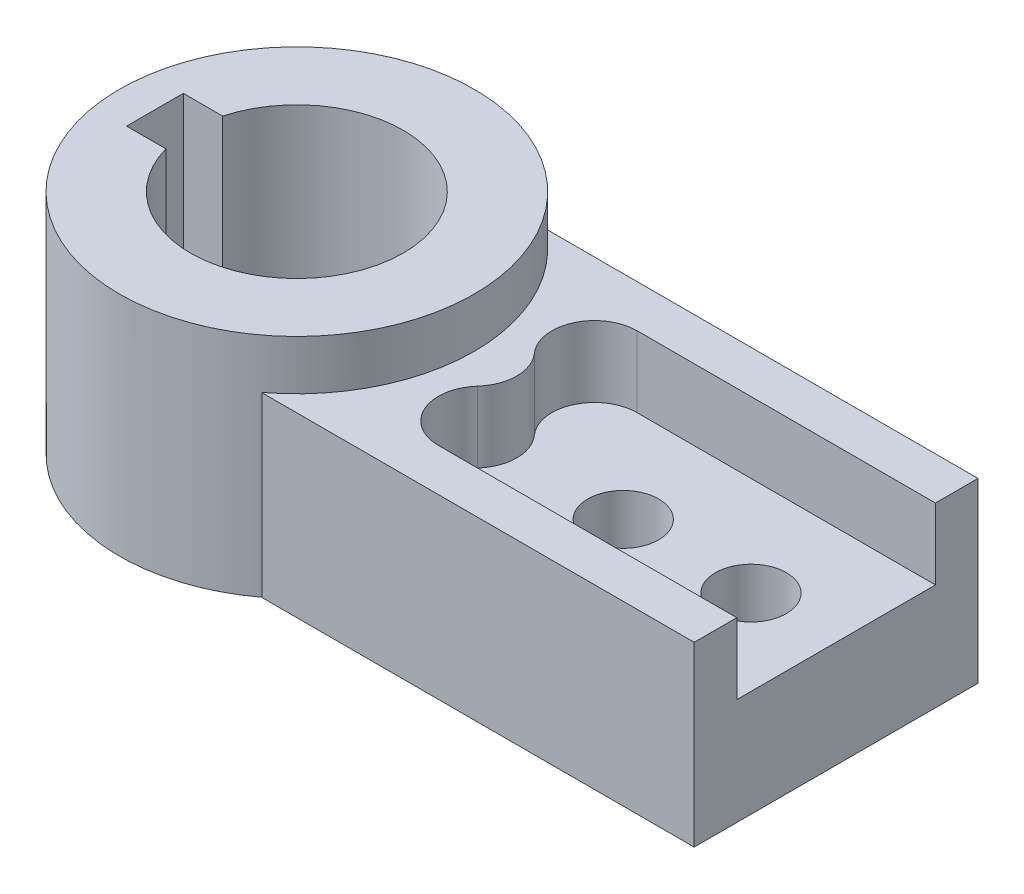
ISO-10303-21;
HEADER;
FILE_DESCRIPTION(('STEP AP214'),'2;1');
FILE_NAME('part.step','',(''),(''),'','','');
FILE_SCHEMA(('AUTOMOTIVE_DESIGN { 1 0 10303 214 1 1 1 1 }'));
ENDSEC;
DATA;
#1=APPLICATION_CONTEXT('core data for automotive mechanical design processes');
#2=APPLICATION_PROTOCOL_DEFINITION('international standard','automotive_design',2000,#1);
#3=PRODUCT_CONTEXT('',#1,'mechanical');
#4=PRODUCT('Part','Part','',(#3));
#5=PRODUCT_RELATED_PRODUCT_CATEGORY('part','',(#4));
#6=PRODUCT_DEFINITION_FORMATION('','',#4);
#7=PRODUCT_DEFINITION_CONTEXT('part definition',#1,'design');
#8=PRODUCT_DEFINITION('design','',#6,#7);
#9=PRODUCT_DEFINITION_SHAPE('','',#8);
#10=(LENGTH_UNIT() NAMED_UNIT(*) SI_UNIT(.MILLI.,.METRE.));
#11=(NAMED_UNIT(*) PLANE_ANGLE_UNIT() SI_UNIT($,.RADIAN.));
#12=(NAMED_UNIT(*) SI_UNIT($,.STERADIAN.) SOLID_ANGLE_UNIT());
#13=UNCERTAINTY_MEASURE_WITH_UNIT(LENGTH_MEASURE(1.E-05),#10,'distance_accuracy_value','');
#14=(GEOMETRIC_REPRESENTATION_CONTEXT(3) GLOBAL_UNCERTAINTY_ASSIGNED_CONTEXT((#13)) GLOBAL_UNIT_ASSIGNED_CONTEXT((#10,
#11,#12)) REPRESENTATION_CONTEXT('',''));
#15=CARTESIAN_POINT('',(0.,0.,0.));
#16=DIRECTION('',(0.,0.,1.));
#17=DIRECTION('',(1.,0.,0.));
#18=AXIS2_PLACEMENT_3D('',#15,#16,#17);
#19=CARTESIAN_POINT('',(0.,32.,0.));
#20=DIRECTION('',(0.,-1.,0.));
#21=DIRECTION('',(0.,0.,-1.));
#22=AXIS2_PLACEMENT_3D('',#19,#20,#21);
#23=CYLINDRICAL_SURFACE('',#22,25.);
#24=CARTESIAN_POINT('',(0.,32.,0.));
#25=DIRECTION('',(0.,1.,0.));
#26=DIRECTION('',(0.,0.,1.));
#27=AXIS2_PLACEMENT_3D('',#24,#25,#26);
#28=CIRCLE('',#27,25.);
#29=CARTESIAN_POINT('',(0.,32.,25.));
#30=VERTEX_POINT('',#29);
#31=EDGE_CURVE('E271',#30,#30,#28,.T.);
#32=ORIENTED_EDGE('',*,*,#31,.F.);
#33=EDGE_LOOP('',(#32));
#34=FACE_BOUND('',#33,.T.);
#35=DIRECTION('',(0.,-1.,0.));
#36=VECTOR('',#35,1.);
#37=CARTESIAN_POINT('',(15.0745700855955,32.,19.9438546107434));
#38=LINE('',#37,#36);
#39=CARTESIAN_POINT('',(15.0745700855955,25.,19.9438546107434));
#40=VERTEX_POINT('',#39);
#41=CARTESIAN_POINT('',(15.0745700855955,0.,19.9438546107434));
#42=VERTEX_POINT('',#41);
#43=EDGE_CURVE('E280',#40,#42,#38,.T.);
#44=ORIENTED_EDGE('',*,*,#43,.F.);
#45=CARTESIAN_POINT('',(0.,25.,0.));
#46=DIRECTION('',(0.,1.,0.));
#47=DIRECTION('',(0.,0.,1.));
#48=AXIS2_PLACEMENT_3D('',#45,#46,#47);
#49=CIRCLE('',#48,25.);
#50=CARTESIAN_POINT('',(15.0745700855955,25.,-19.9438546107434));
#51=VERTEX_POINT('',#50);
#52=EDGE_CURVE('E274',#40,#51,#49,.T.);
#53=ORIENTED_EDGE('',*,*,#52,.T.);
#54=DIRECTION('',(0.,-1.,0.));
#55=VECTOR('',#54,1.);
#56=CARTESIAN_POINT('',(15.0745700855955,32.,-19.9438546107434));
#57=LINE('',#56,#55);
#58=CARTESIAN_POINT('',(15.0745700855955,0.,-19.9438546107434));
#59=VERTEX_POINT('',#58);
#60=EDGE_CURVE('E277',#59,#51,#57,.F.);
#61=ORIENTED_EDGE('',*,*,#60,.F.);
#62=CARTESIAN_POINT('',(0.,0.,0.));
#63=DIRECTION('',(0.,1.,0.));
#64=DIRECTION('',(0.,0.,1.));
#65=AXIS2_PLACEMENT_3D('',#62,#63,#64);
#66=CIRCLE('',#65,25.);
#67=EDGE_CURVE('E268',#59,#42,#66,.T.);
#68=ORIENTED_EDGE('',*,*,#67,.T.);
#69=EDGE_LOOP('',(#44,#53,#61,#68));
#70=FACE_BOUND('',#69,.T.);
#71=ADVANCED_FACE('F35',(#34,#70),#23,.T.);
#72=CARTESIAN_POINT('',(0.,32.,0.));
#73=DIRECTION('',(0.,1.,0.));
#74=DIRECTION('',(0.,0.,1.));
#75=AXIS2_PLACEMENT_3D('',#72,#73,#74);
#76=PLANE('',#75);
#77=DIRECTION('',(-1.,0.,0.));
#78=VECTOR('',#77,1.);
#79=CARTESIAN_POINT('',(-20.,32.,-4.));
#80=LINE('',#79,#78);
#81=CARTESIAN_POINT('',(-14.456832294801,32.,-4.));
#82=VERTEX_POINT('',#81);
#83=CARTESIAN_POINT('',(-20.,32.,-4.));
#84=VERTEX_POINT('',#83);
#85=EDGE_CURVE('E153',#82,#84,#80,.T.);
#86=ORIENTED_EDGE('',*,*,#85,.F.);
#87=CARTESIAN_POINT('',(0.,32.,0.));
#88=DIRECTION('',(0.,1.,0.));
#89=DIRECTION('',(0.,0.,1.));
#90=AXIS2_PLACEMENT_3D('',#87,#88,#89);
#91=CIRCLE('',#90,15.);
#92=CARTESIAN_POINT('',(-14.456832294801,32.,4.));
#93=VERTEX_POINT('',#92);
#94=EDGE_CURVE('E167',#93,#82,#91,.T.);
#95=ORIENTED_EDGE('',*,*,#94,.F.);
#96=DIRECTION('',(1.,0.,0.));
#97=VECTOR('',#96,1.);
#98=CARTESIAN_POINT('',(-20.,32.,4.));
#99=LINE('',#98,#97);
#100=CARTESIAN_POINT('',(-20.,32.,4.));
#101=VERTEX_POINT('',#100);
#102=EDGE_CURVE('E49',#101,#93,#99,.T.);
#103=ORIENTED_EDGE('',*,*,#102,.F.);
#104=DIRECTION('',(0.,0.,1.));
#105=VECTOR('',#104,1.);
#106=CARTESIAN_POINT('',(-20.,32.,-4.));
#107=LINE('',#106,#105);
#108=EDGE_CURVE('E156',#84,#101,#107,.T.);
#109=ORIENTED_EDGE('',*,*,#108,.F.);
#110=EDGE_LOOP('',(#86,#95,#103,#109));
#111=FACE_BOUND('',#110,.T.);
#112=ORIENTED_EDGE('',*,*,#31,.T.);
#113=EDGE_LOOP('',(#112));
#114=FACE_BOUND('',#113,.T.);
#115=ADVANCED_FACE('F164',(#111,#114),#76,.T.);
#116=CARTESIAN_POINT('',(0.,0.,0.));
#117=DIRECTION('',(0.,1.,0.));
#118=DIRECTION('',(0.,0.,1.));
#119=AXIS2_PLACEMENT_3D('',#116,#117,#118);
#120=PLANE('',#119);
#121=CARTESIAN_POINT('',(46.,0.,0.));
#122=DIRECTION('',(0.,1.,0.));
#123=DIRECTION('',(0.,0.,1.));
#124=AXIS2_PLACEMENT_3D('',#121,#122,#123);
#125=CIRCLE('',#124,5.);
#126=CARTESIAN_POINT('',(46.,0.,5.));
#127=VERTEX_POINT('',#126);
#128=EDGE_CURVE('E185',#127,#127,#125,.T.);
#129=ORIENTED_EDGE('',*,*,#128,.T.);
#130=EDGE_LOOP('',(#129));
#131=FACE_BOUND('',#130,.T.);
#132=CARTESIAN_POINT('',(64.,0.,0.));
#133=DIRECTION('',(0.,1.,0.));
#134=DIRECTION('',(0.,0.,1.));
#135=AXIS2_PLACEMENT_3D('',#132,#133,#134);
#136=CIRCLE('',#135,5.);
#137=CARTESIAN_POINT('',(64.,0.,5.));
#138=VERTEX_POINT('',#137);
#139=EDGE_CURVE('E180',#138,#138,#136,.T.);
#140=ORIENTED_EDGE('',*,*,#139,.T.);
#141=EDGE_LOOP('',(#140));
#142=FACE_BOUND('',#141,.T.);
#143=DIRECTION('',(0.,0.,1.));
#144=VECTOR('',#143,1.);
#145=CARTESIAN_POINT('',(15.0745700855955,0.,-20.));
#146=LINE('',#145,#144);
#147=CARTESIAN_POINT('',(15.0745700855955,0.,20.));
#148=VERTEX_POINT('',#147);
#149=EDGE_CURVE('E249',#42,#148,#146,.T.);
#150=ORIENTED_EDGE('',*,*,#149,.F.);
#151=ORIENTED_EDGE('',*,*,#67,.F.);
#152=CARTESIAN_POINT('',(15.0745700855955,0.,-20.));
#153=VERTEX_POINT('',#152);
#154=EDGE_CURVE('E250',#153,#59,#146,.T.);
#155=ORIENTED_EDGE('',*,*,#154,.F.);
#156=DIRECTION('',(-1.,0.,0.));
#157=VECTOR('',#156,1.);
#158=CARTESIAN_POINT('',(15.0745700855955,0.,-20.));
#159=LINE('',#158,#157);
#160=CARTESIAN_POINT('',(76.,0.,-20.));
#161=VERTEX_POINT('',#160);
#162=EDGE_CURVE('E247',#161,#153,#159,.T.);
#163=ORIENTED_EDGE('',*,*,#162,.F.);
#164=DIRECTION('',(0.,0.,-1.));
#165=VECTOR('',#164,1.);
#166=CARTESIAN_POINT('',(76.,0.,-20.));
#167=LINE('',#166,#165);
#168=CARTESIAN_POINT('',(76.,0.,20.));
#169=VERTEX_POINT('',#168);
#170=EDGE_CURVE('E222',#169,#161,#167,.T.);
#171=ORIENTED_EDGE('',*,*,#170,.F.);
#172=DIRECTION('',(1.,0.,0.));
#173=VECTOR('',#172,1.);
#174=CARTESIAN_POINT('',(15.0745700855955,0.,20.));
#175=LINE('',#174,#173);
#176=EDGE_CURVE('E253',#148,#169,#175,.T.);
#177=ORIENTED_EDGE('',*,*,#176,.F.);
#178=EDGE_LOOP('',(#150,#151,#155,#163,#171,#177));
#179=FACE_BOUND('',#178,.T.);
#180=CARTESIAN_POINT('',(0.,0.,0.));
#181=DIRECTION('',(0.,1.,0.));
#182=DIRECTION('',(0.,0.,1.));
#183=AXIS2_PLACEMENT_3D('',#180,#181,#182);
#184=CIRCLE('',#183,15.);
#185=CARTESIAN_POINT('',(-14.456832294801,0.,4.));
#186=VERTEX_POINT('',#185);
#187=CARTESIAN_POINT('',(-14.456832294801,0.,-4.));
#188=VERTEX_POINT('',#187);
#189=EDGE_CURVE('E266',#186,#188,#184,.T.);
#190=ORIENTED_EDGE('',*,*,#189,.T.);
#191=DIRECTION('',(-1.,0.,0.));
#192=VECTOR('',#191,1.);
#193=CARTESIAN_POINT('',(0.,0.,-4.));
#194=LINE('',#193,#192);
#195=CARTESIAN_POINT('',(-20.,0.,-4.));
#196=VERTEX_POINT('',#195);
#197=EDGE_CURVE('E173',#188,#196,#194,.T.);
#198=ORIENTED_EDGE('',*,*,#197,.T.);
#199=DIRECTION('',(0.,0.,1.));
#200=VECTOR('',#199,1.);
#201=CARTESIAN_POINT('',(-20.,0.,0.));
#202=LINE('',#201,#200);
#203=CARTESIAN_POINT('',(-20.,0.,4.));
#204=VERTEX_POINT('',#203);
#205=EDGE_CURVE('E11',#196,#204,#202,.T.);
#206=ORIENTED_EDGE('',*,*,#205,.T.);
#207=DIRECTION('',(1.,0.,0.));
#208=VECTOR('',#207,1.);
#209=CARTESIAN_POINT('',(0.,0.,4.));
#210=LINE('',#209,#208);
#211=EDGE_CURVE('E150',#204,#186,#210,.T.);
#212=ORIENTED_EDGE('',*,*,#211,.T.);
#213=EDGE_LOOP('',(#190,#198,#206,#212));
#214=FACE_BOUND('',#213,.T.);
#215=ADVANCED_FACE('F291',(#131,#142,#179,#214),#120,.F.);
#216=CARTESIAN_POINT('',(0.,32.,0.));
#217=DIRECTION('',(0.,-1.,0.));
#218=DIRECTION('',(0.,0.,-1.));
#219=AXIS2_PLACEMENT_3D('',#216,#217,#218);
#220=CYLINDRICAL_SURFACE('',#219,15.);
#221=DIRECTION('',(0.,-1.,0.));
#222=VECTOR('',#221,1.);
#223=CARTESIAN_POINT('',(-14.456832294801,32.,-4.));
#224=LINE('',#223,#222);
#225=EDGE_CURVE('E42',#188,#82,#224,.F.);
#226=ORIENTED_EDGE('',*,*,#225,.F.);
#227=ORIENTED_EDGE('',*,*,#189,.F.);
#228=DIRECTION('',(0.,-1.,0.));
#229=VECTOR('',#228,1.);
#230=CARTESIAN_POINT('',(-14.456832294801,32.,4.));
#231=LINE('',#230,#229);
#232=EDGE_CURVE('E283',#93,#186,#231,.T.);
#233=ORIENTED_EDGE('',*,*,#232,.F.);
#234=ORIENTED_EDGE('',*,*,#94,.T.);
#235=EDGE_LOOP('',(#226,#227,#233,#234));
#236=FACE_BOUND('',#235,.T.);
#237=ADVANCED_FACE('F289',(#236),#220,.F.);
#238=CARTESIAN_POINT('',(15.0745700855955,25.,-20.));
#239=DIRECTION('',(1.,0.,0.));
#240=DIRECTION('',(0.,0.,-1.));
#241=AXIS2_PLACEMENT_3D('',#238,#239,#240);
#242=PLANE('',#241);
#243=DIRECTION('',(0.,0.,1.));
#244=VECTOR('',#243,1.);
#245=CARTESIAN_POINT('',(15.0745700855955,25.,-20.));
#246=LINE('',#245,#244);
#247=CARTESIAN_POINT('',(15.0745700855955,25.,20.));
#248=VERTEX_POINT('',#247);
#249=EDGE_CURVE('E238',#40,#248,#246,.T.);
#250=ORIENTED_EDGE('',*,*,#249,.F.);
#251=ORIENTED_EDGE('',*,*,#43,.T.);
#252=ORIENTED_EDGE('',*,*,#149,.T.);
#253=DIRECTION('',(0.,-1.,0.));
#254=VECTOR('',#253,1.);
#255=CARTESIAN_POINT('',(15.0745700855955,25.,20.));
#256=LINE('',#255,#254);
#257=EDGE_CURVE('E257',#248,#148,#256,.T.);
#258=ORIENTED_EDGE('',*,*,#257,.F.);
#259=EDGE_LOOP('',(#250,#251,#252,#258));
#260=FACE_BOUND('',#259,.T.);
#261=ADVANCED_FACE('F298',(#260),#242,.F.);
#262=ORIENTED_EDGE('',*,*,#154,.T.);
#263=ORIENTED_EDGE('',*,*,#60,.T.);
#264=CARTESIAN_POINT('',(15.0745700855955,25.,-20.));
#265=VERTEX_POINT('',#264);
#266=EDGE_CURVE('E239',#265,#51,#246,.T.);
#267=ORIENTED_EDGE('',*,*,#266,.F.);
#268=DIRECTION('',(0.,-1.,0.));
#269=VECTOR('',#268,1.);
#270=CARTESIAN_POINT('',(15.0745700855955,25.,-20.));
#271=LINE('',#270,#269);
#272=EDGE_CURVE('E260',#265,#153,#271,.T.);
#273=ORIENTED_EDGE('',*,*,#272,.T.);
#274=EDGE_LOOP('',(#262,#263,#267,#273));
#275=FACE_BOUND('',#274,.T.);
#276=ADVANCED_FACE('F354',(#275),#242,.F.);
#277=CARTESIAN_POINT('',(76.,25.,-20.));
#278=DIRECTION('',(-1.,0.,0.));
#279=DIRECTION('',(0.,0.,1.));
#280=AXIS2_PLACEMENT_3D('',#277,#278,#279);
#281=PLANE('',#280);
#282=DIRECTION('',(0.,0.,-1.));
#283=VECTOR('',#282,1.);
#284=CARTESIAN_POINT('',(76.,15.,-14.));
#285=LINE('',#284,#283);
#286=CARTESIAN_POINT('',(76.,15.,14.));
#287=VERTEX_POINT('',#286);
#288=CARTESIAN_POINT('',(76.,15.,-14.));
#289=VERTEX_POINT('',#288);
#290=EDGE_CURVE('E189',#287,#289,#285,.T.);
#291=ORIENTED_EDGE('',*,*,#290,.F.);
#292=DIRECTION('',(0.,1.,0.));
#293=VECTOR('',#292,1.);
#294=CARTESIAN_POINT('',(76.,15.,14.));
#295=LINE('',#294,#293);
#296=CARTESIAN_POINT('',(76.,25.,14.));
#297=VERTEX_POINT('',#296);
#298=EDGE_CURVE('E219',#287,#297,#295,.T.);
#299=ORIENTED_EDGE('',*,*,#298,.T.);
#300=DIRECTION('',(0.,0.,-1.));
#301=VECTOR('',#300,1.);
#302=CARTESIAN_POINT('',(76.,25.,-20.));
#303=LINE('',#302,#301);
#304=CARTESIAN_POINT('',(76.,25.,20.));
#305=VERTEX_POINT('',#304);
#306=EDGE_CURVE('E232',#305,#297,#303,.T.);
#307=ORIENTED_EDGE('',*,*,#306,.F.);
#308=DIRECTION('',(0.,-1.,0.));
#309=VECTOR('',#308,1.);
#310=CARTESIAN_POINT('',(76.,25.,20.));
#311=LINE('',#310,#309);
#312=EDGE_CURVE('E244',#305,#169,#311,.T.);
#313=ORIENTED_EDGE('',*,*,#312,.T.);
#314=ORIENTED_EDGE('',*,*,#170,.T.);
#315=DIRECTION('',(0.,-1.,0.));
#316=VECTOR('',#315,1.);
#317=CARTESIAN_POINT('',(76.,25.,-20.));
#318=LINE('',#317,#316);
#319=CARTESIAN_POINT('',(76.,25.,-20.));
#320=VERTEX_POINT('',#319);
#321=EDGE_CURVE('E263',#320,#161,#318,.T.);
#322=ORIENTED_EDGE('',*,*,#321,.F.);
#323=CARTESIAN_POINT('',(76.,25.,-14.));
#324=VERTEX_POINT('',#323);
#325=EDGE_CURVE('E236',#324,#320,#303,.T.);
#326=ORIENTED_EDGE('',*,*,#325,.F.);
#327=DIRECTION('',(0.,1.,0.));
#328=VECTOR('',#327,1.);
#329=CARTESIAN_POINT('',(76.,15.,-14.));
#330=LINE('',#329,#328);
#331=EDGE_CURVE('E57',#289,#324,#330,.T.);
#332=ORIENTED_EDGE('',*,*,#331,.F.);
#333=EDGE_LOOP('',(#291,#299,#307,#313,#314,#322,#326,#332));
#334=FACE_BOUND('',#333,.T.);
#335=ADVANCED_FACE('F327',(#334),#281,.F.);
#336=CARTESIAN_POINT('',(15.0745700855955,25.,-20.));
#337=DIRECTION('',(0.,0.,1.));
#338=DIRECTION('',(1.,0.,0.));
#339=AXIS2_PLACEMENT_3D('',#336,#337,#338);
#340=PLANE('',#339);
#341=ORIENTED_EDGE('',*,*,#162,.T.);
#342=ORIENTED_EDGE('',*,*,#272,.F.);
#343=DIRECTION('',(-1.,0.,0.));
#344=VECTOR('',#343,1.);
#345=CARTESIAN_POINT('',(15.0745700855955,25.,-20.));
#346=LINE('',#345,#344);
#347=EDGE_CURVE('E235',#320,#265,#346,.T.);
#348=ORIENTED_EDGE('',*,*,#347,.F.);
#349=ORIENTED_EDGE('',*,*,#321,.T.);
#350=EDGE_LOOP('',(#341,#342,#348,#349));
#351=FACE_BOUND('',#350,.T.);
#352=ADVANCED_FACE('F350',(#351),#340,.F.);
#353=CARTESIAN_POINT('',(15.0745700855955,25.,20.));
#354=DIRECTION('',(0.,0.,-1.));
#355=DIRECTION('',(-1.,0.,0.));
#356=AXIS2_PLACEMENT_3D('',#353,#354,#355);
#357=PLANE('',#356);
#358=ORIENTED_EDGE('',*,*,#176,.T.);
#359=ORIENTED_EDGE('',*,*,#312,.F.);
#360=DIRECTION('',(1.,0.,0.));
#361=VECTOR('',#360,1.);
#362=CARTESIAN_POINT('',(15.0745700855955,25.,20.));
#363=LINE('',#362,#361);
#364=EDGE_CURVE('E242',#248,#305,#363,.T.);
#365=ORIENTED_EDGE('',*,*,#364,.F.);
#366=ORIENTED_EDGE('',*,*,#257,.T.);
#367=EDGE_LOOP('',(#358,#359,#365,#366));
#368=FACE_BOUND('',#367,.T.);
#369=ADVANCED_FACE('F322',(#368),#357,.F.);
#370=CARTESIAN_POINT('',(0.,25.,0.));
#371=DIRECTION('',(0.,1.,0.));
#372=DIRECTION('',(0.,0.,1.));
#373=AXIS2_PLACEMENT_3D('',#370,#371,#372);
#374=PLANE('',#373);
#375=DIRECTION('',(1.,0.,0.));
#376=VECTOR('',#375,1.);
#377=CARTESIAN_POINT('',(76.,25.,14.));
#378=LINE('',#377,#376);
#379=CARTESIAN_POINT('',(33.9442719099992,25.,14.));
#380=VERTEX_POINT('',#379);
#381=EDGE_CURVE('E193',#380,#297,#378,.T.);
#382=ORIENTED_EDGE('',*,*,#381,.F.);
#383=CARTESIAN_POINT('',(33.9442719099992,25.,7.99999999999999));
#384=DIRECTION('',(0.,1.,0.));
#385=DIRECTION('',(0.,0.,1.));
#386=AXIS2_PLACEMENT_3D('',#383,#384,#385);
#387=CIRCLE('',#386,6.);
#388=CARTESIAN_POINT('',(29.4721359549996,25.,3.99999999999999));
#389=VERTEX_POINT('',#388);
#390=EDGE_CURVE('E215',#389,#380,#387,.T.);
#391=ORIENTED_EDGE('',*,*,#390,.F.);
#392=CARTESIAN_POINT('',(25.,25.,0.));
#393=DIRECTION('',(0.,-1.,0.));
#394=DIRECTION('',(0.,0.,-1.));
#395=AXIS2_PLACEMENT_3D('',#392,#393,#394);
#396=CIRCLE('',#395,6.);
#397=CARTESIAN_POINT('',(29.4721359549996,25.,-4.));
#398=VERTEX_POINT('',#397);
#399=EDGE_CURVE('E212',#398,#389,#396,.T.);
#400=ORIENTED_EDGE('',*,*,#399,.F.);
#401=CARTESIAN_POINT('',(33.9442719099992,25.,-7.99999999999999));
#402=DIRECTION('',(0.,1.,0.));
#403=DIRECTION('',(0.,0.,1.));
#404=AXIS2_PLACEMENT_3D('',#401,#402,#403);
#405=CIRCLE('',#404,6.);
#406=CARTESIAN_POINT('',(33.9442719099992,25.,-14.));
#407=VERTEX_POINT('',#406);
#408=EDGE_CURVE('E209',#407,#398,#405,.T.);
#409=ORIENTED_EDGE('',*,*,#408,.F.);
#410=DIRECTION('',(-1.,0.,0.));
#411=VECTOR('',#410,1.);
#412=CARTESIAN_POINT('',(76.,25.,-14.));
#413=LINE('',#412,#411);
#414=EDGE_CURVE('E188',#324,#407,#413,.T.);
#415=ORIENTED_EDGE('',*,*,#414,.F.);
#416=ORIENTED_EDGE('',*,*,#325,.T.);
#417=ORIENTED_EDGE('',*,*,#347,.T.);
#418=ORIENTED_EDGE('',*,*,#266,.T.);
#419=ORIENTED_EDGE('',*,*,#52,.F.);
#420=ORIENTED_EDGE('',*,*,#249,.T.);
#421=ORIENTED_EDGE('',*,*,#364,.T.);
#422=ORIENTED_EDGE('',*,*,#306,.T.);
#423=EDGE_LOOP('',(#382,#391,#400,#409,#415,#416,#417,#418,#419,#420,#421,#422));
#424=FACE_BOUND('',#423,.T.);
#425=ADVANCED_FACE('F315',(#424),#374,.T.);
#426=CARTESIAN_POINT('',(76.,15.,14.));
#427=DIRECTION('',(0.,0.,1.));
#428=DIRECTION('',(1.,0.,0.));
#429=AXIS2_PLACEMENT_3D('',#426,#427,#428);
#430=PLANE('',#429);
#431=ORIENTED_EDGE('',*,*,#381,.T.);
#432=ORIENTED_EDGE('',*,*,#298,.F.);
#433=DIRECTION('',(1.,0.,0.));
#434=VECTOR('',#433,1.);
#435=CARTESIAN_POINT('',(76.,15.,14.));
#436=LINE('',#435,#434);
#437=CARTESIAN_POINT('',(33.9442719099992,15.,14.));
#438=VERTEX_POINT('',#437);
#439=EDGE_CURVE('E205',#438,#287,#436,.T.);
#440=ORIENTED_EDGE('',*,*,#439,.F.);
#441=DIRECTION('',(0.,1.,0.));
#442=VECTOR('',#441,1.);
#443=CARTESIAN_POINT('',(33.9442719099992,15.,14.));
#444=LINE('',#443,#442);
#445=EDGE_CURVE('E223',#438,#380,#444,.T.);
#446=ORIENTED_EDGE('',*,*,#445,.T.);
#447=EDGE_LOOP('',(#431,#432,#440,#446));
#448=FACE_BOUND('',#447,.T.);
#449=ADVANCED_FACE('F331',(#448),#430,.F.);
#450=CARTESIAN_POINT('',(33.9442719099992,15.,7.99999999999999));
#451=DIRECTION('',(0.,1.,0.));
#452=DIRECTION('',(0.,0.,1.));
#453=AXIS2_PLACEMENT_3D('',#450,#451,#452);
#454=CYLINDRICAL_SURFACE('',#453,6.);
#455=ORIENTED_EDGE('',*,*,#390,.T.);
#456=ORIENTED_EDGE('',*,*,#445,.F.);
#457=CARTESIAN_POINT('',(33.9442719099992,15.,7.99999999999999));
#458=DIRECTION('',(0.,1.,0.));
#459=DIRECTION('',(0.,0.,1.));
#460=AXIS2_PLACEMENT_3D('',#457,#458,#459);
#461=CIRCLE('',#460,6.);
#462=CARTESIAN_POINT('',(29.4721359549996,15.,3.99999999999999));
#463=VERTEX_POINT('',#462);
#464=EDGE_CURVE('E202',#463,#438,#461,.T.);
#465=ORIENTED_EDGE('',*,*,#464,.F.);
#466=DIRECTION('',(0.,1.,0.));
#467=VECTOR('',#466,1.);
#468=CARTESIAN_POINT('',(29.4721359549996,15.,3.99999999999999));
#469=LINE('',#468,#467);
#470=EDGE_CURVE('E225',#463,#389,#469,.T.);
#471=ORIENTED_EDGE('',*,*,#470,.T.);
#472=EDGE_LOOP('',(#455,#456,#465,#471));
#473=FACE_BOUND('',#472,.T.);
#474=ADVANCED_FACE('F337',(#473),#454,.F.);
#475=CARTESIAN_POINT('',(25.,15.,0.));
#476=DIRECTION('',(0.,1.,0.));
#477=DIRECTION('',(0.,0.,1.));
#478=AXIS2_PLACEMENT_3D('',#475,#476,#477);
#479=CYLINDRICAL_SURFACE('',#478,6.);
#480=ORIENTED_EDGE('',*,*,#399,.T.);
#481=ORIENTED_EDGE('',*,*,#470,.F.);
#482=CARTESIAN_POINT('',(25.,15.,0.));
#483=DIRECTION('',(0.,-1.,0.));
#484=DIRECTION('',(0.,0.,-1.));
#485=AXIS2_PLACEMENT_3D('',#482,#483,#484);
#486=CIRCLE('',#485,6.);
#487=CARTESIAN_POINT('',(29.4721359549996,15.,-4.));
#488=VERTEX_POINT('',#487);
#489=EDGE_CURVE('E199',#488,#463,#486,.T.);
#490=ORIENTED_EDGE('',*,*,#489,.F.);
#491=DIRECTION('',(0.,1.,0.));
#492=VECTOR('',#491,1.);
#493=CARTESIAN_POINT('',(29.4721359549996,15.,-4.));
#494=LINE('',#493,#492);
#495=EDGE_CURVE('E227',#488,#398,#494,.T.);
#496=ORIENTED_EDGE('',*,*,#495,.T.);
#497=EDGE_LOOP('',(#480,#481,#490,#496));
#498=FACE_BOUND('',#497,.T.);
#499=ADVANCED_FACE('F341',(#498),#479,.T.);
#500=CARTESIAN_POINT('',(33.9442719099992,15.,-7.99999999999999));
#501=DIRECTION('',(0.,1.,0.));
#502=DIRECTION('',(0.,0.,1.));
#503=AXIS2_PLACEMENT_3D('',#500,#501,#502);
#504=CYLINDRICAL_SURFACE('',#503,6.);
#505=ORIENTED_EDGE('',*,*,#408,.T.);
#506=ORIENTED_EDGE('',*,*,#495,.F.);
#507=CARTESIAN_POINT('',(33.9442719099992,15.,-7.99999999999999));
#508=DIRECTION('',(0.,1.,0.));
#509=DIRECTION('',(0.,0.,1.));
#510=AXIS2_PLACEMENT_3D('',#507,#508,#509);
#511=CIRCLE('',#510,6.);
#512=CARTESIAN_POINT('',(33.9442719099992,15.,-14.));
#513=VERTEX_POINT('',#512);
#514=EDGE_CURVE('E196',#513,#488,#511,.T.);
#515=ORIENTED_EDGE('',*,*,#514,.F.);
#516=DIRECTION('',(0.,1.,0.));
#517=VECTOR('',#516,1.);
#518=CARTESIAN_POINT('',(33.9442719099992,15.,-14.));
#519=LINE('',#518,#517);
#520=EDGE_CURVE('E229',#513,#407,#519,.T.);
#521=ORIENTED_EDGE('',*,*,#520,.T.);
#522=EDGE_LOOP('',(#505,#506,#515,#521));
#523=FACE_BOUND('',#522,.T.);
#524=ADVANCED_FACE('F344',(#523),#504,.F.);
#525=CARTESIAN_POINT('',(76.,15.,-14.));
#526=DIRECTION('',(0.,0.,-1.));
#527=DIRECTION('',(-1.,0.,0.));
#528=AXIS2_PLACEMENT_3D('',#525,#526,#527);
#529=PLANE('',#528);
#530=ORIENTED_EDGE('',*,*,#414,.T.);
#531=ORIENTED_EDGE('',*,*,#520,.F.);
#532=DIRECTION('',(-1.,0.,0.));
#533=VECTOR('',#532,1.);
#534=CARTESIAN_POINT('',(76.,15.,-14.));
#535=LINE('',#534,#533);
#536=EDGE_CURVE('E192',#289,#513,#535,.T.);
#537=ORIENTED_EDGE('',*,*,#536,.F.);
#538=ORIENTED_EDGE('',*,*,#331,.T.);
#539=EDGE_LOOP('',(#530,#531,#537,#538));
#540=FACE_BOUND('',#539,.T.);
#541=ADVANCED_FACE('F345',(#540),#529,.F.);
#542=CARTESIAN_POINT('',(33.9442719099992,15.,7.99999999999999));
#543=DIRECTION('',(0.,1.,0.));
#544=DIRECTION('',(0.,0.,1.));
#545=AXIS2_PLACEMENT_3D('',#542,#543,#544);
#546=PLANE('',#545);
#547=CARTESIAN_POINT('',(46.,15.,0.));
#548=DIRECTION('',(0.,1.,0.));
#549=DIRECTION('',(0.,0.,1.));
#550=AXIS2_PLACEMENT_3D('',#547,#548,#549);
#551=CIRCLE('',#550,5.);
#552=CARTESIAN_POINT('',(46.,15.,5.));
#553=VERTEX_POINT('',#552);
#554=EDGE_CURVE('E177',#553,#553,#551,.T.);
#555=ORIENTED_EDGE('',*,*,#554,.F.);
#556=EDGE_LOOP('',(#555));
#557=FACE_BOUND('',#556,.T.);
#558=CARTESIAN_POINT('',(64.,15.,0.));
#559=DIRECTION('',(0.,1.,0.));
#560=DIRECTION('',(0.,0.,1.));
#561=AXIS2_PLACEMENT_3D('',#558,#559,#560);
#562=CIRCLE('',#561,5.);
#563=CARTESIAN_POINT('',(64.,15.,5.));
#564=VERTEX_POINT('',#563);
#565=EDGE_CURVE('E176',#564,#564,#562,.T.);
#566=ORIENTED_EDGE('',*,*,#565,.F.);
#567=EDGE_LOOP('',(#566));
#568=FACE_BOUND('',#567,.T.);
#569=ORIENTED_EDGE('',*,*,#290,.T.);
#570=ORIENTED_EDGE('',*,*,#536,.T.);
#571=ORIENTED_EDGE('',*,*,#514,.T.);
#572=ORIENTED_EDGE('',*,*,#489,.T.);
#573=ORIENTED_EDGE('',*,*,#464,.T.);
#574=ORIENTED_EDGE('',*,*,#439,.T.);
#575=EDGE_LOOP('',(#569,#570,#571,#572,#573,#574));
#576=FACE_BOUND('',#575,.T.);
#577=ADVANCED_FACE('F333',(#557,#568,#576),#546,.T.);
#578=CARTESIAN_POINT('',(64.,-33.,0.));
#579=DIRECTION('',(0.,1.,0.));
#580=DIRECTION('',(0.,0.,1.));
#581=AXIS2_PLACEMENT_3D('',#578,#579,#580);
#582=CYLINDRICAL_SURFACE('',#581,5.);
#583=ORIENTED_EDGE('',*,*,#565,.T.);
#584=EDGE_LOOP('',(#583));
#585=FACE_BOUND('',#584,.T.);
#586=ORIENTED_EDGE('',*,*,#139,.F.);
#587=EDGE_LOOP('',(#586));
#588=FACE_BOUND('',#587,.T.);
#589=ADVANCED_FACE('F388',(#585,#588),#582,.F.);
#590=CARTESIAN_POINT('',(46.,-33.,0.));
#591=DIRECTION('',(0.,1.,0.));
#592=DIRECTION('',(0.,0.,1.));
#593=AXIS2_PLACEMENT_3D('',#590,#591,#592);
#594=CYLINDRICAL_SURFACE('',#593,5.);
#595=ORIENTED_EDGE('',*,*,#554,.T.);
#596=EDGE_LOOP('',(#595));
#597=FACE_BOUND('',#596,.T.);
#598=ORIENTED_EDGE('',*,*,#128,.F.);
#599=EDGE_LOOP('',(#598));
#600=FACE_BOUND('',#599,.T.);
#601=ADVANCED_FACE('F392',(#597,#600),#594,.F.);
#602=CARTESIAN_POINT('',(-20.,-16.,-4.));
#603=DIRECTION('',(-1.,0.,0.));
#604=DIRECTION('',(0.,0.,1.));
#605=AXIS2_PLACEMENT_3D('',#602,#603,#604);
#606=PLANE('',#605);
#607=DIRECTION('',(0.,1.,0.));
#608=VECTOR('',#607,1.);
#609=CARTESIAN_POINT('',(-20.,-16.,-4.));
#610=LINE('',#609,#608);
#611=EDGE_CURVE('E152',#196,#84,#610,.T.);
#612=ORIENTED_EDGE('',*,*,#611,.T.);
#613=ORIENTED_EDGE('',*,*,#108,.T.);
#614=DIRECTION('',(0.,1.,0.));
#615=VECTOR('',#614,1.);
#616=CARTESIAN_POINT('',(-20.,-16.,4.));
#617=LINE('',#616,#615);
#618=EDGE_CURVE('E146',#204,#101,#617,.T.);
#619=ORIENTED_EDGE('',*,*,#618,.F.);
#620=ORIENTED_EDGE('',*,*,#205,.F.);
#621=EDGE_LOOP('',(#612,#613,#619,#620));
#622=FACE_BOUND('',#621,.T.);
#623=ADVANCED_FACE('F157',(#622),#606,.F.);
#624=CARTESIAN_POINT('',(-20.,-16.,-4.));
#625=DIRECTION('',(0.,0.,-1.));
#626=DIRECTION('',(-1.,0.,0.));
#627=AXIS2_PLACEMENT_3D('',#624,#625,#626);
#628=PLANE('',#627);
#629=ORIENTED_EDGE('',*,*,#225,.T.);
#630=ORIENTED_EDGE('',*,*,#85,.T.);
#631=ORIENTED_EDGE('',*,*,#611,.F.);
#632=ORIENTED_EDGE('',*,*,#197,.F.);
#633=EDGE_LOOP('',(#629,#630,#631,#632));
#634=FACE_BOUND('',#633,.T.);
#635=ADVANCED_FACE('F286',(#634),#628,.F.);
#636=CARTESIAN_POINT('',(-20.,-16.,4.));
#637=DIRECTION('',(0.,0.,1.));
#638=DIRECTION('',(1.,0.,0.));
#639=AXIS2_PLACEMENT_3D('',#636,#637,#638);
#640=PLANE('',#639);
#641=ORIENTED_EDGE('',*,*,#618,.T.);
#642=ORIENTED_EDGE('',*,*,#102,.T.);
#643=ORIENTED_EDGE('',*,*,#232,.T.);
#644=ORIENTED_EDGE('',*,*,#211,.F.);
#645=EDGE_LOOP('',(#641,#642,#643,#644));
#646=FACE_BOUND('',#645,.T.);
#647=ADVANCED_FACE('F148',(#646),#640,.F.);
#648=CLOSED_SHELL('',(#71,#115,#215,#237,#261,#276,#335,#352,#369,#425,#449,#474,#499,#524,#541,
#577,#589,#601,#623,#635,#647));
#649=MANIFOLD_SOLID_BREP('B2',#648);
#650=ADVANCED_BREP_SHAPE_REPRESENTATION('',(#18,#649),#14);
#651=SHAPE_DEFINITION_REPRESENTATION(#9,#650);
ENDSEC;
END-ISO-10303-21;
